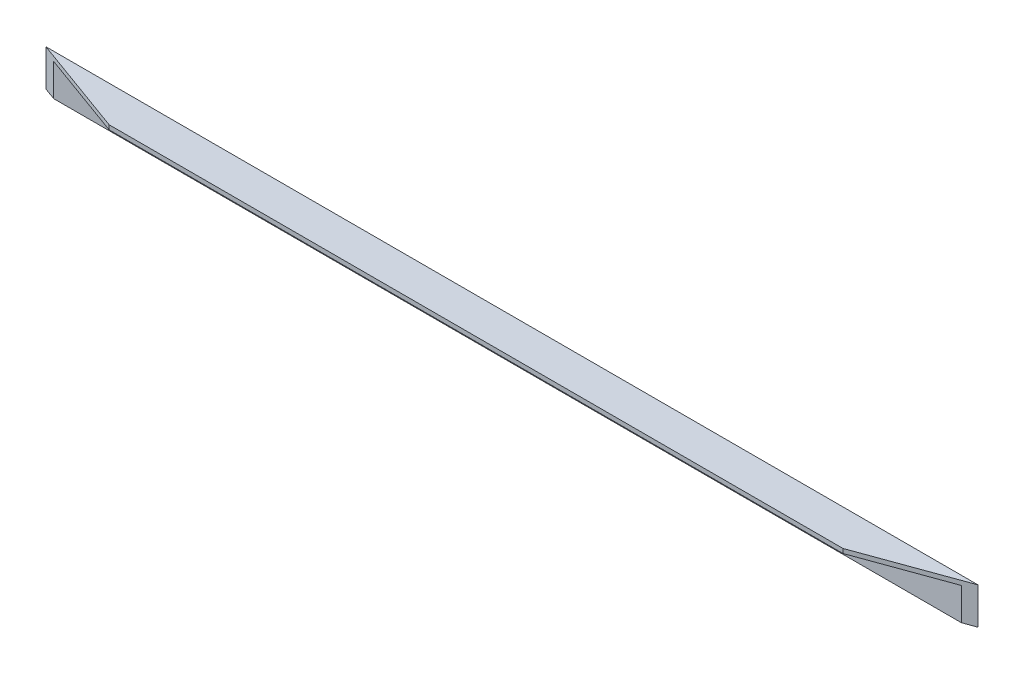
ISO-10303-21;
HEADER;
FILE_DESCRIPTION(('STEP AP214'),'2;1');
FILE_NAME('part.step','',(''),(''),'','','');
FILE_SCHEMA(('AUTOMOTIVE_DESIGN { 1 0 10303 214 1 1 1 1 }'));
ENDSEC;
DATA;
#1=APPLICATION_CONTEXT('core data for automotive mechanical design processes');
#2=APPLICATION_PROTOCOL_DEFINITION('international standard','automotive_design',2000,#1);
#3=PRODUCT_CONTEXT('',#1,'mechanical');
#4=PRODUCT('Part','Part','',(#3));
#5=PRODUCT_RELATED_PRODUCT_CATEGORY('part','',(#4));
#6=PRODUCT_DEFINITION_FORMATION('','',#4);
#7=PRODUCT_DEFINITION_CONTEXT('part definition',#1,'design');
#8=PRODUCT_DEFINITION('design','',#6,#7);
#9=PRODUCT_DEFINITION_SHAPE('','',#8);
#10=(LENGTH_UNIT() NAMED_UNIT(*) SI_UNIT(.MILLI.,.METRE.));
#11=(NAMED_UNIT(*) PLANE_ANGLE_UNIT() SI_UNIT($,.RADIAN.));
#12=(NAMED_UNIT(*) SI_UNIT($,.STERADIAN.) SOLID_ANGLE_UNIT());
#13=UNCERTAINTY_MEASURE_WITH_UNIT(LENGTH_MEASURE(1.E-05),#10,'distance_accuracy_value','');
#14=(GEOMETRIC_REPRESENTATION_CONTEXT(3) GLOBAL_UNCERTAINTY_ASSIGNED_CONTEXT((#13)) GLOBAL_UNIT_ASSIGNED_CONTEXT((#10,
#11,#12)) REPRESENTATION_CONTEXT('',''));
#15=CARTESIAN_POINT('',(0.,0.,0.));
#16=DIRECTION('',(0.,0.,1.));
#17=DIRECTION('',(1.,0.,0.));
#18=AXIS2_PLACEMENT_3D('',#15,#16,#17);
#19=CARTESIAN_POINT('',(-1270.,-50.,12.));
#20=DIRECTION('',(0.,1.,0.));
#21=DIRECTION('',(0.,0.,1.));
#22=AXIS2_PLACEMENT_3D('',#19,#20,#21);
#23=PLANE('',#22);
#24=DIRECTION('',(1.,0.,0.));
#25=VECTOR('',#24,1.);
#26=CARTESIAN_POINT('',(-1270.,-50.,12.));
#27=LINE('',#26,#25);
#28=CARTESIAN_POINT('',(-1236.9387755102,-50.,12.));
#29=VERTEX_POINT('',#28);
#30=CARTESIAN_POINT('',(1236.9387755102,-50.,12.));
#31=VERTEX_POINT('',#30);
#32=EDGE_CURVE('E108',#29,#31,#27,.T.);
#33=ORIENTED_EDGE('',*,*,#32,.F.);
#34=DIRECTION('',(-0.939996554641713,0.,-0.341183934647733));
#35=VECTOR('',#34,1.);
#36=CARTESIAN_POINT('',(-1266.15145932318,-50.,1.39687772714057));
#37=LINE('',#36,#35);
#38=CARTESIAN_POINT('',(-1270.,-50.,0.));
#39=VERTEX_POINT('',#38);
#40=EDGE_CURVE('E128',#29,#39,#37,.T.);
#41=ORIENTED_EDGE('',*,*,#40,.T.);
#42=DIRECTION('',(1.,0.,0.));
#43=VECTOR('',#42,1.);
#44=CARTESIAN_POINT('',(-1270.,-50.,0.));
#45=LINE('',#44,#43);
#46=CARTESIAN_POINT('',(1270.,-50.,0.));
#47=VERTEX_POINT('',#46);
#48=EDGE_CURVE('E102',#39,#47,#45,.T.);
#49=ORIENTED_EDGE('',*,*,#48,.T.);
#50=DIRECTION('',(-0.939996554641713,0.,0.341183934647733));
#51=VECTOR('',#50,1.);
#52=CARTESIAN_POINT('',(-978.176088432076,-50.,816.004654319791));
#53=LINE('',#52,#51);
#54=EDGE_CURVE('E126',#47,#31,#53,.T.);
#55=ORIENTED_EDGE('',*,*,#54,.T.);
#56=EDGE_LOOP('',(#33,#41,#49,#55));
#57=FACE_BOUND('',#56,.T.);
#58=ADVANCED_FACE('F32',(#57),#23,.F.);
#59=CARTESIAN_POINT('',(-1270.,50.,12.));
#60=DIRECTION('',(0.,-1.,0.));
#61=DIRECTION('',(0.,0.,-1.));
#62=AXIS2_PLACEMENT_3D('',#59,#60,#61);
#63=PLANE('',#62);
#64=DIRECTION('',(-1.,0.,0.));
#65=VECTOR('',#64,1.);
#66=CARTESIAN_POINT('',(-1270.,50.,0.));
#67=LINE('',#66,#65);
#68=CARTESIAN_POINT('',(1270.,50.,0.));
#69=VERTEX_POINT('',#68);
#70=CARTESIAN_POINT('',(-1270.,50.,0.));
#71=VERTEX_POINT('',#70);
#72=EDGE_CURVE('E95',#69,#71,#67,.T.);
#73=ORIENTED_EDGE('',*,*,#72,.T.);
#74=DIRECTION('',(-0.939996554641713,0.,-0.341183934647733));
#75=VECTOR('',#74,1.);
#76=CARTESIAN_POINT('',(-1270.,50.,0.));
#77=LINE('',#76,#75);
#78=CARTESIAN_POINT('',(-1000.,50.,98.));
#79=VERTEX_POINT('',#78);
#80=EDGE_CURVE('E85',#79,#71,#77,.T.);
#81=ORIENTED_EDGE('',*,*,#80,.F.);
#82=DIRECTION('',(-1.,0.,0.));
#83=VECTOR('',#82,1.);
#84=CARTESIAN_POINT('',(-1270.,50.,98.));
#85=LINE('',#84,#83);
#86=CARTESIAN_POINT('',(999.999999999999,50.,98.));
#87=VERTEX_POINT('',#86);
#88=EDGE_CURVE('E93',#87,#79,#85,.T.);
#89=ORIENTED_EDGE('',*,*,#88,.F.);
#90=DIRECTION('',(-0.939996554641713,0.,0.341183934647733));
#91=VECTOR('',#90,1.);
#92=CARTESIAN_POINT('',(1270.,50.,0.));
#93=LINE('',#92,#91);
#94=EDGE_CURVE('E55',#69,#87,#93,.T.);
#95=ORIENTED_EDGE('',*,*,#94,.F.);
#96=EDGE_LOOP('',(#73,#81,#89,#95));
#97=FACE_BOUND('',#96,.T.);
#98=ADVANCED_FACE('F92',(#97),#63,.F.);
#99=CARTESIAN_POINT('',(-1270.,-50.,12.));
#100=DIRECTION('',(0.,0.,1.));
#101=DIRECTION('',(1.,0.,0.));
#102=AXIS2_PLACEMENT_3D('',#99,#100,#101);
#103=PLANE('',#102);
#104=DIRECTION('',(0.,1.,0.));
#105=VECTOR('',#104,1.);
#106=CARTESIAN_POINT('',(-1236.9387755102,-50.,12.));
#107=LINE('',#106,#105);
#108=CARTESIAN_POINT('',(-1236.9387755102,38.,12.));
#109=VERTEX_POINT('',#108);
#110=EDGE_CURVE('E140',#29,#109,#107,.T.);
#111=ORIENTED_EDGE('',*,*,#110,.F.);
#112=ORIENTED_EDGE('',*,*,#32,.T.);
#113=DIRECTION('',(0.,-1.,0.));
#114=VECTOR('',#113,1.);
#115=CARTESIAN_POINT('',(1236.9387755102,-50.,12.));
#116=LINE('',#115,#114);
#117=CARTESIAN_POINT('',(1236.9387755102,38.,11.9999999999999));
#118=VERTEX_POINT('',#117);
#119=EDGE_CURVE('E124',#118,#31,#116,.T.);
#120=ORIENTED_EDGE('',*,*,#119,.F.);
#121=DIRECTION('',(1.,0.,0.));
#122=VECTOR('',#121,1.);
#123=CARTESIAN_POINT('',(-1270.,38.,12.));
#124=LINE('',#123,#122);
#125=EDGE_CURVE('E35',#109,#118,#124,.T.);
#126=ORIENTED_EDGE('',*,*,#125,.F.);
#127=EDGE_LOOP('',(#111,#112,#120,#126));
#128=FACE_BOUND('',#127,.T.);
#129=ADVANCED_FACE('F139',(#128),#103,.T.);
#130=CARTESIAN_POINT('',(-1270.,-50.,0.));
#131=DIRECTION('',(0.,0.,1.));
#132=DIRECTION('',(1.,0.,0.));
#133=AXIS2_PLACEMENT_3D('',#130,#131,#132);
#134=PLANE('',#133);
#135=DIRECTION('',(0.,-1.,0.));
#136=VECTOR('',#135,1.);
#137=CARTESIAN_POINT('',(-1270.,50.,0.));
#138=LINE('',#137,#136);
#139=EDGE_CURVE('E99',#71,#39,#138,.T.);
#140=ORIENTED_EDGE('',*,*,#139,.F.);
#141=ORIENTED_EDGE('',*,*,#72,.F.);
#142=DIRECTION('',(0.,1.,0.));
#143=VECTOR('',#142,1.);
#144=CARTESIAN_POINT('',(1270.,50.,0.));
#145=LINE('',#144,#143);
#146=EDGE_CURVE('E112',#47,#69,#145,.T.);
#147=ORIENTED_EDGE('',*,*,#146,.F.);
#148=ORIENTED_EDGE('',*,*,#48,.F.);
#149=EDGE_LOOP('',(#140,#141,#147,#148));
#150=FACE_BOUND('',#149,.T.);
#151=ADVANCED_FACE('F144',(#150),#134,.F.);
#152=CARTESIAN_POINT('',(-1270.,38.,98.));
#153=DIRECTION('',(0.,1.,0.));
#154=DIRECTION('',(0.,0.,1.));
#155=AXIS2_PLACEMENT_3D('',#152,#153,#154);
#156=PLANE('',#155);
#157=DIRECTION('',(1.,0.,0.));
#158=VECTOR('',#157,1.);
#159=CARTESIAN_POINT('',(-1270.,38.,98.));
#160=LINE('',#159,#158);
#161=CARTESIAN_POINT('',(-1000.,38.,98.));
#162=VERTEX_POINT('',#161);
#163=CARTESIAN_POINT('',(1000.,38.,98.));
#164=VERTEX_POINT('',#163);
#165=EDGE_CURVE('E100',#162,#164,#160,.T.);
#166=ORIENTED_EDGE('',*,*,#165,.F.);
#167=DIRECTION('',(-0.939996554641713,0.,-0.341183934647733));
#168=VECTOR('',#167,1.);
#169=CARTESIAN_POINT('',(-1238.57025113934,38.,11.4078347716475));
#170=LINE('',#169,#168);
#171=EDGE_CURVE('E47',#162,#109,#170,.T.);
#172=ORIENTED_EDGE('',*,*,#171,.T.);
#173=ORIENTED_EDGE('',*,*,#125,.T.);
#174=DIRECTION('',(-0.939996554641713,0.,0.341183934647733));
#175=VECTOR('',#174,1.);
#176=CARTESIAN_POINT('',(-1005.75729661592,38.,826.015611364297));
#177=LINE('',#176,#175);
#178=EDGE_CURVE('E119',#118,#164,#177,.T.);
#179=ORIENTED_EDGE('',*,*,#178,.T.);
#180=EDGE_LOOP('',(#166,#172,#173,#179));
#181=FACE_BOUND('',#180,.T.);
#182=ADVANCED_FACE('F122',(#181),#156,.F.);
#183=CARTESIAN_POINT('',(-1270.,38.,98.));
#184=DIRECTION('',(0.,0.,1.));
#185=DIRECTION('',(1.,0.,0.));
#186=AXIS2_PLACEMENT_3D('',#183,#184,#185);
#187=PLANE('',#186);
#188=DIRECTION('',(0.,1.,0.));
#189=VECTOR('',#188,1.);
#190=CARTESIAN_POINT('',(-1000.,38.,98.));
#191=LINE('',#190,#189);
#192=EDGE_CURVE('E11',#162,#79,#191,.T.);
#193=ORIENTED_EDGE('',*,*,#192,.F.);
#194=ORIENTED_EDGE('',*,*,#165,.T.);
#195=DIRECTION('',(0.,-1.,0.));
#196=VECTOR('',#195,1.);
#197=CARTESIAN_POINT('',(1000.,38.,98.));
#198=LINE('',#197,#196);
#199=EDGE_CURVE('E41',#87,#164,#198,.T.);
#200=ORIENTED_EDGE('',*,*,#199,.F.);
#201=ORIENTED_EDGE('',*,*,#88,.T.);
#202=EDGE_LOOP('',(#193,#194,#200,#201));
#203=FACE_BOUND('',#202,.T.);
#204=ADVANCED_FACE('F98',(#203),#187,.T.);
#205=CARTESIAN_POINT('',(1270.,-50.000025,0.));
#206=DIRECTION('',(-0.341183934647733,0.,-0.939996554641713));
#207=DIRECTION('',(-0.939996554641713,0.,0.341183934647733));
#208=AXIS2_PLACEMENT_3D('',#205,#206,#207);
#209=PLANE('',#208);
#210=ORIENTED_EDGE('',*,*,#146,.T.);
#211=ORIENTED_EDGE('',*,*,#94,.T.);
#212=ORIENTED_EDGE('',*,*,#199,.T.);
#213=ORIENTED_EDGE('',*,*,#178,.F.);
#214=ORIENTED_EDGE('',*,*,#119,.T.);
#215=ORIENTED_EDGE('',*,*,#54,.F.);
#216=EDGE_LOOP('',(#210,#211,#212,#213,#214,#215));
#217=FACE_BOUND('',#216,.T.);
#218=ADVANCED_FACE('F117',(#217),#209,.F.);
#219=CARTESIAN_POINT('',(-1270.,-50.000025,0.));
#220=DIRECTION('',(0.341183934647733,0.,-0.939996554641713));
#221=DIRECTION('',(-0.939996554641713,0.,-0.341183934647733));
#222=AXIS2_PLACEMENT_3D('',#219,#220,#221);
#223=PLANE('',#222);
#224=ORIENTED_EDGE('',*,*,#110,.T.);
#225=ORIENTED_EDGE('',*,*,#171,.F.);
#226=ORIENTED_EDGE('',*,*,#192,.T.);
#227=ORIENTED_EDGE('',*,*,#80,.T.);
#228=ORIENTED_EDGE('',*,*,#139,.T.);
#229=ORIENTED_EDGE('',*,*,#40,.F.);
#230=EDGE_LOOP('',(#224,#225,#226,#227,#228,#229));
#231=FACE_BOUND('',#230,.T.);
#232=ADVANCED_FACE('F84',(#231),#223,.F.);
#233=CLOSED_SHELL('',(#58,#98,#129,#151,#182,#204,#218,#232));
#234=MANIFOLD_SOLID_BREP('B2',#233);
#235=ADVANCED_BREP_SHAPE_REPRESENTATION('',(#18,#234),#14);
#236=SHAPE_DEFINITION_REPRESENTATION(#9,#235);
ENDSEC;
END-ISO-10303-21;
